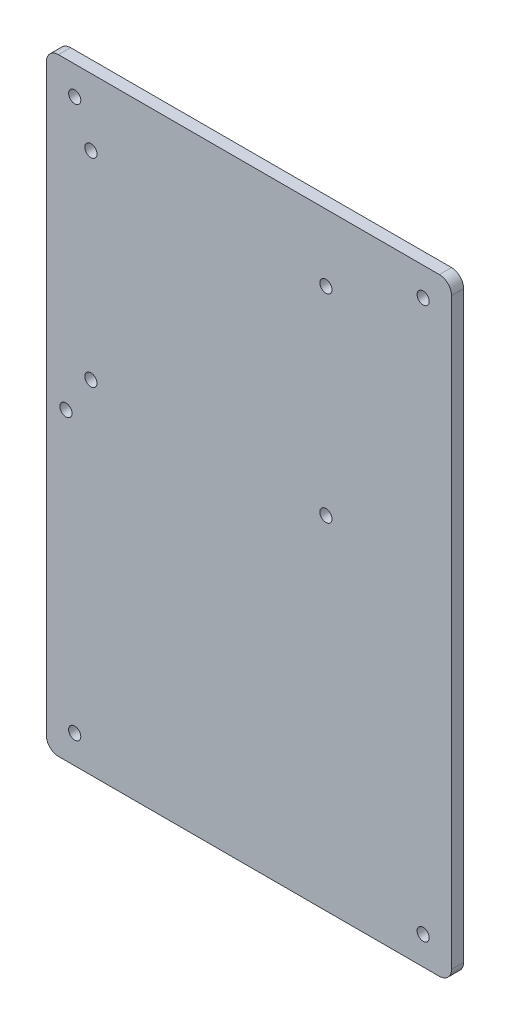
ISO-10303-21;
HEADER;
FILE_DESCRIPTION(('STEP AP214'),'2;1');
FILE_NAME('part.step','',(''),(''),'','','');
FILE_SCHEMA(('AUTOMOTIVE_DESIGN { 1 0 10303 214 1 1 1 1 }'));
ENDSEC;
DATA;
#1=APPLICATION_CONTEXT('core data for automotive mechanical design processes');
#2=APPLICATION_PROTOCOL_DEFINITION('international standard','automotive_design',2000,#1);
#3=PRODUCT_CONTEXT('',#1,'mechanical');
#4=PRODUCT('Part','Part','',(#3));
#5=PRODUCT_RELATED_PRODUCT_CATEGORY('part','',(#4));
#6=PRODUCT_DEFINITION_FORMATION('','',#4);
#7=PRODUCT_DEFINITION_CONTEXT('part definition',#1,'design');
#8=PRODUCT_DEFINITION('design','',#6,#7);
#9=PRODUCT_DEFINITION_SHAPE('','',#8);
#10=(LENGTH_UNIT() NAMED_UNIT(*) SI_UNIT(.MILLI.,.METRE.));
#11=(NAMED_UNIT(*) PLANE_ANGLE_UNIT() SI_UNIT($,.RADIAN.));
#12=(NAMED_UNIT(*) SI_UNIT($,.STERADIAN.) SOLID_ANGLE_UNIT());
#13=UNCERTAINTY_MEASURE_WITH_UNIT(LENGTH_MEASURE(1.E-05),#10,'distance_accuracy_value','');
#14=(GEOMETRIC_REPRESENTATION_CONTEXT(3) GLOBAL_UNCERTAINTY_ASSIGNED_CONTEXT((#13)) GLOBAL_UNIT_ASSIGNED_CONTEXT((#10,
#11,#12)) REPRESENTATION_CONTEXT('',''));
#15=CARTESIAN_POINT('',(0.,0.,0.));
#16=DIRECTION('',(0.,0.,1.));
#17=DIRECTION('',(1.,0.,0.));
#18=AXIS2_PLACEMENT_3D('',#15,#16,#17);
#19=CARTESIAN_POINT('',(-102.,-59.,40.));
#20=DIRECTION('',(0.,0.,1.));
#21=DIRECTION('',(1.,0.,0.));
#22=AXIS2_PLACEMENT_3D('',#19,#20,#21);
#23=CYLINDRICAL_SURFACE('',#22,3.);
#24=CARTESIAN_POINT('',(-102.,-59.,43.));
#25=DIRECTION('',(0.,0.,1.));
#26=DIRECTION('',(1.,0.,0.));
#27=AXIS2_PLACEMENT_3D('',#24,#25,#26);
#28=CIRCLE('',#27,3.);
#29=CARTESIAN_POINT('',(-105.,-59.,43.));
#30=VERTEX_POINT('',#29);
#31=CARTESIAN_POINT('',(-102.,-62.,43.));
#32=VERTEX_POINT('',#31);
#33=EDGE_CURVE('E134',#30,#32,#28,.T.);
#34=ORIENTED_EDGE('',*,*,#33,.F.);
#35=DIRECTION('',(0.,0.,1.));
#36=VECTOR('',#35,1.);
#37=CARTESIAN_POINT('',(-105.,-59.,40.));
#38=LINE('',#37,#36);
#39=CARTESIAN_POINT('',(-105.,-59.,40.));
#40=VERTEX_POINT('',#39);
#41=EDGE_CURVE('E11',#40,#30,#38,.T.);
#42=ORIENTED_EDGE('',*,*,#41,.F.);
#43=CARTESIAN_POINT('',(-102.,-59.,40.));
#44=DIRECTION('',(0.,0.,1.));
#45=DIRECTION('',(1.,0.,0.));
#46=AXIS2_PLACEMENT_3D('',#43,#44,#45);
#47=CIRCLE('',#46,3.);
#48=CARTESIAN_POINT('',(-102.,-62.,40.));
#49=VERTEX_POINT('',#48);
#50=EDGE_CURVE('E155',#40,#49,#47,.T.);
#51=ORIENTED_EDGE('',*,*,#50,.T.);
#52=DIRECTION('',(0.,0.,1.));
#53=VECTOR('',#52,1.);
#54=CARTESIAN_POINT('',(-102.,-62.,40.));
#55=LINE('',#54,#53);
#56=EDGE_CURVE('E40',#49,#32,#55,.T.);
#57=ORIENTED_EDGE('',*,*,#56,.T.);
#58=EDGE_LOOP('',(#34,#42,#51,#57));
#59=FACE_BOUND('',#58,.T.);
#60=ADVANCED_FACE('F37',(#59),#23,.T.);
#61=CARTESIAN_POINT('',(-105.,85.,40.));
#62=DIRECTION('',(-1.,0.,0.));
#63=DIRECTION('',(0.,0.,1.));
#64=AXIS2_PLACEMENT_3D('',#61,#62,#63);
#65=PLANE('',#64);
#66=DIRECTION('',(0.,-1.,0.));
#67=VECTOR('',#66,1.);
#68=CARTESIAN_POINT('',(-105.,85.,43.));
#69=LINE('',#68,#67);
#70=CARTESIAN_POINT('',(-105.,85.,43.));
#71=VERTEX_POINT('',#70);
#72=EDGE_CURVE('E153',#71,#30,#69,.T.);
#73=ORIENTED_EDGE('',*,*,#72,.F.);
#74=DIRECTION('',(0.,0.,1.));
#75=VECTOR('',#74,1.);
#76=CARTESIAN_POINT('',(-105.,85.,40.));
#77=LINE('',#76,#75);
#78=CARTESIAN_POINT('',(-105.,85.,40.));
#79=VERTEX_POINT('',#78);
#80=EDGE_CURVE('E46',#79,#71,#77,.T.);
#81=ORIENTED_EDGE('',*,*,#80,.F.);
#82=DIRECTION('',(0.,-1.,0.));
#83=VECTOR('',#82,1.);
#84=CARTESIAN_POINT('',(-105.,85.,40.));
#85=LINE('',#84,#83);
#86=EDGE_CURVE('E124',#79,#40,#85,.T.);
#87=ORIENTED_EDGE('',*,*,#86,.T.);
#88=ORIENTED_EDGE('',*,*,#41,.T.);
#89=EDGE_LOOP('',(#73,#81,#87,#88));
#90=FACE_BOUND('',#89,.T.);
#91=ADVANCED_FACE('F167',(#90),#65,.T.);
#92=CARTESIAN_POINT('',(-102.,85.,40.));
#93=DIRECTION('',(0.,0.,1.));
#94=DIRECTION('',(1.,0.,0.));
#95=AXIS2_PLACEMENT_3D('',#92,#93,#94);
#96=CYLINDRICAL_SURFACE('',#95,3.);
#97=CARTESIAN_POINT('',(-102.,85.,43.));
#98=DIRECTION('',(0.,0.,1.));
#99=DIRECTION('',(1.,0.,0.));
#100=AXIS2_PLACEMENT_3D('',#97,#98,#99);
#101=CIRCLE('',#100,3.);
#102=CARTESIAN_POINT('',(-102.,88.,43.));
#103=VERTEX_POINT('',#102);
#104=EDGE_CURVE('E111',#103,#71,#101,.T.);
#105=ORIENTED_EDGE('',*,*,#104,.F.);
#106=DIRECTION('',(0.,0.,1.));
#107=VECTOR('',#106,1.);
#108=CARTESIAN_POINT('',(-102.,88.,40.));
#109=LINE('',#108,#107);
#110=CARTESIAN_POINT('',(-102.,88.,40.));
#111=VERTEX_POINT('',#110);
#112=EDGE_CURVE('E106',#111,#103,#109,.T.);
#113=ORIENTED_EDGE('',*,*,#112,.F.);
#114=CARTESIAN_POINT('',(-102.,85.,40.));
#115=DIRECTION('',(0.,0.,1.));
#116=DIRECTION('',(1.,0.,0.));
#117=AXIS2_PLACEMENT_3D('',#114,#115,#116);
#118=CIRCLE('',#117,3.);
#119=EDGE_CURVE('E109',#111,#79,#118,.T.);
#120=ORIENTED_EDGE('',*,*,#119,.T.);
#121=ORIENTED_EDGE('',*,*,#80,.T.);
#122=EDGE_LOOP('',(#105,#113,#120,#121));
#123=FACE_BOUND('',#122,.T.);
#124=ADVANCED_FACE('F108',(#123),#96,.T.);
#125=CARTESIAN_POINT('',(-8.,88.,40.));
#126=DIRECTION('',(0.,1.,0.));
#127=DIRECTION('',(0.,0.,1.));
#128=AXIS2_PLACEMENT_3D('',#125,#126,#127);
#129=PLANE('',#128);
#130=DIRECTION('',(-1.,0.,0.));
#131=VECTOR('',#130,1.);
#132=CARTESIAN_POINT('',(-8.,88.,43.));
#133=LINE('',#132,#131);
#134=CARTESIAN_POINT('',(-8.,88.,43.));
#135=VERTEX_POINT('',#134);
#136=EDGE_CURVE('E150',#135,#103,#133,.T.);
#137=ORIENTED_EDGE('',*,*,#136,.F.);
#138=DIRECTION('',(0.,0.,1.));
#139=VECTOR('',#138,1.);
#140=CARTESIAN_POINT('',(-8.,88.,40.));
#141=LINE('',#140,#139);
#142=CARTESIAN_POINT('',(-8.,88.,40.));
#143=VERTEX_POINT('',#142);
#144=EDGE_CURVE('E116',#143,#135,#141,.T.);
#145=ORIENTED_EDGE('',*,*,#144,.F.);
#146=DIRECTION('',(-1.,0.,0.));
#147=VECTOR('',#146,1.);
#148=CARTESIAN_POINT('',(-8.,88.,40.));
#149=LINE('',#148,#147);
#150=EDGE_CURVE('E122',#143,#111,#149,.T.);
#151=ORIENTED_EDGE('',*,*,#150,.T.);
#152=ORIENTED_EDGE('',*,*,#112,.T.);
#153=EDGE_LOOP('',(#137,#145,#151,#152));
#154=FACE_BOUND('',#153,.T.);
#155=ADVANCED_FACE('F126',(#154),#129,.T.);
#156=CARTESIAN_POINT('',(-8.,85.,40.));
#157=DIRECTION('',(0.,0.,1.));
#158=DIRECTION('',(1.,0.,0.));
#159=AXIS2_PLACEMENT_3D('',#156,#157,#158);
#160=CYLINDRICAL_SURFACE('',#159,2.99999999999999);
#161=CARTESIAN_POINT('',(-8.,85.,43.));
#162=DIRECTION('',(0.,0.,1.));
#163=DIRECTION('',(1.,0.,0.));
#164=AXIS2_PLACEMENT_3D('',#161,#162,#163);
#165=CIRCLE('',#164,2.99999999999999);
#166=CARTESIAN_POINT('',(-5.,85.,43.));
#167=VERTEX_POINT('',#166);
#168=EDGE_CURVE('E147',#167,#135,#165,.T.);
#169=ORIENTED_EDGE('',*,*,#168,.F.);
#170=DIRECTION('',(0.,0.,1.));
#171=VECTOR('',#170,1.);
#172=CARTESIAN_POINT('',(-5.,85.,40.));
#173=LINE('',#172,#171);
#174=CARTESIAN_POINT('',(-5.,85.,40.));
#175=VERTEX_POINT('',#174);
#176=EDGE_CURVE('E159',#175,#167,#173,.T.);
#177=ORIENTED_EDGE('',*,*,#176,.F.);
#178=CARTESIAN_POINT('',(-8.,85.,40.));
#179=DIRECTION('',(0.,0.,1.));
#180=DIRECTION('',(1.,0.,0.));
#181=AXIS2_PLACEMENT_3D('',#178,#179,#180);
#182=CIRCLE('',#181,2.99999999999999);
#183=EDGE_CURVE('E127',#175,#143,#182,.T.);
#184=ORIENTED_EDGE('',*,*,#183,.T.);
#185=ORIENTED_EDGE('',*,*,#144,.T.);
#186=EDGE_LOOP('',(#169,#177,#184,#185));
#187=FACE_BOUND('',#186,.T.);
#188=ADVANCED_FACE('F180',(#187),#160,.T.);
#189=CARTESIAN_POINT('',(-5.,-59.,40.));
#190=DIRECTION('',(1.,0.,0.));
#191=DIRECTION('',(0.,0.,-1.));
#192=AXIS2_PLACEMENT_3D('',#189,#190,#191);
#193=PLANE('',#192);
#194=DIRECTION('',(0.,1.,0.));
#195=VECTOR('',#194,1.);
#196=CARTESIAN_POINT('',(-5.,-59.,43.));
#197=LINE('',#196,#195);
#198=CARTESIAN_POINT('',(-5.,-59.,43.));
#199=VERTEX_POINT('',#198);
#200=EDGE_CURVE('E144',#199,#167,#197,.T.);
#201=ORIENTED_EDGE('',*,*,#200,.F.);
#202=DIRECTION('',(0.,0.,1.));
#203=VECTOR('',#202,1.);
#204=CARTESIAN_POINT('',(-5.,-59.,40.));
#205=LINE('',#204,#203);
#206=CARTESIAN_POINT('',(-5.,-59.,40.));
#207=VERTEX_POINT('',#206);
#208=EDGE_CURVE('E161',#207,#199,#205,.T.);
#209=ORIENTED_EDGE('',*,*,#208,.F.);
#210=DIRECTION('',(0.,1.,0.));
#211=VECTOR('',#210,1.);
#212=CARTESIAN_POINT('',(-5.,-59.,40.));
#213=LINE('',#212,#211);
#214=EDGE_CURVE('E129',#207,#175,#213,.T.);
#215=ORIENTED_EDGE('',*,*,#214,.T.);
#216=ORIENTED_EDGE('',*,*,#176,.T.);
#217=EDGE_LOOP('',(#201,#209,#215,#216));
#218=FACE_BOUND('',#217,.T.);
#219=ADVANCED_FACE('F183',(#218),#193,.T.);
#220=CARTESIAN_POINT('',(-8.,-59.,40.));
#221=DIRECTION('',(0.,0.,1.));
#222=DIRECTION('',(1.,0.,0.));
#223=AXIS2_PLACEMENT_3D('',#220,#221,#222);
#224=CYLINDRICAL_SURFACE('',#223,3.);
#225=CARTESIAN_POINT('',(-8.,-59.,43.));
#226=DIRECTION('',(0.,0.,1.));
#227=DIRECTION('',(1.,0.,0.));
#228=AXIS2_PLACEMENT_3D('',#225,#226,#227);
#229=CIRCLE('',#228,3.);
#230=CARTESIAN_POINT('',(-8.,-62.,43.));
#231=VERTEX_POINT('',#230);
#232=EDGE_CURVE('E141',#231,#199,#229,.T.);
#233=ORIENTED_EDGE('',*,*,#232,.F.);
#234=DIRECTION('',(0.,0.,1.));
#235=VECTOR('',#234,1.);
#236=CARTESIAN_POINT('',(-8.,-62.,40.));
#237=LINE('',#236,#235);
#238=CARTESIAN_POINT('',(-8.,-62.,40.));
#239=VERTEX_POINT('',#238);
#240=EDGE_CURVE('E162',#239,#231,#237,.T.);
#241=ORIENTED_EDGE('',*,*,#240,.F.);
#242=CARTESIAN_POINT('',(-8.,-59.,40.));
#243=DIRECTION('',(0.,0.,1.));
#244=DIRECTION('',(1.,0.,0.));
#245=AXIS2_PLACEMENT_3D('',#242,#243,#244);
#246=CIRCLE('',#245,3.);
#247=EDGE_CURVE('E299',#239,#207,#246,.T.);
#248=ORIENTED_EDGE('',*,*,#247,.T.);
#249=ORIENTED_EDGE('',*,*,#208,.T.);
#250=EDGE_LOOP('',(#233,#241,#248,#249));
#251=FACE_BOUND('',#250,.T.);
#252=ADVANCED_FACE('F187',(#251),#224,.T.);
#253=CARTESIAN_POINT('',(-102.,-62.,40.));
#254=DIRECTION('',(0.,-1.,0.));
#255=DIRECTION('',(0.,0.,-1.));
#256=AXIS2_PLACEMENT_3D('',#253,#254,#255);
#257=PLANE('',#256);
#258=DIRECTION('',(1.,0.,0.));
#259=VECTOR('',#258,1.);
#260=CARTESIAN_POINT('',(-102.,-62.,43.));
#261=LINE('',#260,#259);
#262=EDGE_CURVE('E137',#32,#231,#261,.T.);
#263=ORIENTED_EDGE('',*,*,#262,.F.);
#264=ORIENTED_EDGE('',*,*,#56,.F.);
#265=DIRECTION('',(1.,0.,0.));
#266=VECTOR('',#265,1.);
#267=CARTESIAN_POINT('',(-102.,-62.,40.));
#268=LINE('',#267,#266);
#269=EDGE_CURVE('E297',#49,#239,#268,.T.);
#270=ORIENTED_EDGE('',*,*,#269,.T.);
#271=ORIENTED_EDGE('',*,*,#240,.T.);
#272=EDGE_LOOP('',(#263,#264,#270,#271));
#273=FACE_BOUND('',#272,.T.);
#274=ADVANCED_FACE('F164',(#273),#257,.T.);
#275=CARTESIAN_POINT('',(-102.,-59.,40.));
#276=DIRECTION('',(0.,0.,1.));
#277=DIRECTION('',(1.,0.,0.));
#278=AXIS2_PLACEMENT_3D('',#275,#276,#277);
#279=PLANE('',#278);
#280=CARTESIAN_POINT('',(-12.,-55.,40.));
#281=DIRECTION('',(0.,0.,1.));
#282=DIRECTION('',(-1.,0.,0.));
#283=AXIS2_PLACEMENT_3D('',#280,#281,#282);
#284=CIRCLE('',#283,1.5);
#285=CARTESIAN_POINT('',(-13.5,-55.,40.));
#286=VERTEX_POINT('',#285);
#287=EDGE_CURVE('E242',#286,#286,#284,.T.);
#288=ORIENTED_EDGE('',*,*,#287,.T.);
#289=EDGE_LOOP('',(#288));
#290=FACE_BOUND('',#289,.T.);
#291=CARTESIAN_POINT('',(-98.,81.,40.));
#292=DIRECTION('',(0.,0.,1.));
#293=DIRECTION('',(-1.,0.,0.));
#294=AXIS2_PLACEMENT_3D('',#291,#292,#293);
#295=CIRCLE('',#294,1.5);
#296=CARTESIAN_POINT('',(-99.5,81.,40.));
#297=VERTEX_POINT('',#296);
#298=EDGE_CURVE('E250',#297,#297,#295,.T.);
#299=ORIENTED_EDGE('',*,*,#298,.T.);
#300=EDGE_LOOP('',(#299));
#301=FACE_BOUND('',#300,.T.);
#302=CARTESIAN_POINT('',(-98.,-55.,40.));
#303=DIRECTION('',(0.,0.,1.));
#304=DIRECTION('',(-1.,0.,0.));
#305=AXIS2_PLACEMENT_3D('',#302,#303,#304);
#306=CIRCLE('',#305,1.5);
#307=CARTESIAN_POINT('',(-99.5,-55.,40.));
#308=VERTEX_POINT('',#307);
#309=EDGE_CURVE('E256',#308,#308,#306,.T.);
#310=ORIENTED_EDGE('',*,*,#309,.T.);
#311=EDGE_LOOP('',(#310));
#312=FACE_BOUND('',#311,.T.);
#313=CARTESIAN_POINT('',(-12.,81.,40.));
#314=DIRECTION('',(0.,0.,1.));
#315=DIRECTION('',(-1.,0.,0.));
#316=AXIS2_PLACEMENT_3D('',#313,#314,#315);
#317=CIRCLE('',#316,1.5);
#318=CARTESIAN_POINT('',(-13.5,81.,40.));
#319=VERTEX_POINT('',#318);
#320=EDGE_CURVE('E262',#319,#319,#317,.T.);
#321=ORIENTED_EDGE('',*,*,#320,.T.);
#322=EDGE_LOOP('',(#321));
#323=FACE_BOUND('',#322,.T.);
#324=CARTESIAN_POINT('',(-100.157022476196,13.,40.));
#325=DIRECTION('',(0.,0.,1.));
#326=DIRECTION('',(-1.,0.,0.));
#327=AXIS2_PLACEMENT_3D('',#324,#325,#326);
#328=CIRCLE('',#327,1.5);
#329=CARTESIAN_POINT('',(-101.657022476196,13.,40.));
#330=VERTEX_POINT('',#329);
#331=EDGE_CURVE('E268',#330,#330,#328,.T.);
#332=ORIENTED_EDGE('',*,*,#331,.T.);
#333=EDGE_LOOP('',(#332));
#334=FACE_BOUND('',#333,.T.);
#335=CARTESIAN_POINT('',(-36.,71.5,40.));
#336=DIRECTION('',(0.,0.,1.));
#337=DIRECTION('',(-1.,0.,0.));
#338=AXIS2_PLACEMENT_3D('',#335,#336,#337);
#339=CIRCLE('',#338,1.5);
#340=CARTESIAN_POINT('',(-37.5,71.5,40.));
#341=VERTEX_POINT('',#340);
#342=EDGE_CURVE('E274',#341,#341,#339,.T.);
#343=ORIENTED_EDGE('',*,*,#342,.T.);
#344=EDGE_LOOP('',(#343));
#345=FACE_BOUND('',#344,.T.);
#346=CARTESIAN_POINT('',(-36.,22.5,40.));
#347=DIRECTION('',(0.,0.,1.));
#348=DIRECTION('',(-1.,0.,0.));
#349=AXIS2_PLACEMENT_3D('',#346,#347,#348);
#350=CIRCLE('',#349,1.5);
#351=CARTESIAN_POINT('',(-37.5,22.5,40.));
#352=VERTEX_POINT('',#351);
#353=EDGE_CURVE('E280',#352,#352,#350,.T.);
#354=ORIENTED_EDGE('',*,*,#353,.T.);
#355=EDGE_LOOP('',(#354));
#356=FACE_BOUND('',#355,.T.);
#357=CARTESIAN_POINT('',(-94.,22.5,40.));
#358=DIRECTION('',(0.,0.,1.));
#359=DIRECTION('',(-1.,0.,0.));
#360=AXIS2_PLACEMENT_3D('',#357,#358,#359);
#361=CIRCLE('',#360,1.5);
#362=CARTESIAN_POINT('',(-95.5,22.5,40.));
#363=VERTEX_POINT('',#362);
#364=EDGE_CURVE('E286',#363,#363,#361,.T.);
#365=ORIENTED_EDGE('',*,*,#364,.T.);
#366=EDGE_LOOP('',(#365));
#367=FACE_BOUND('',#366,.T.);
#368=CARTESIAN_POINT('',(-94.,71.5,40.));
#369=DIRECTION('',(0.,0.,1.));
#370=DIRECTION('',(-1.,0.,0.));
#371=AXIS2_PLACEMENT_3D('',#368,#369,#370);
#372=CIRCLE('',#371,1.5);
#373=CARTESIAN_POINT('',(-95.5,71.5,40.));
#374=VERTEX_POINT('',#373);
#375=EDGE_CURVE('E138',#374,#374,#372,.T.);
#376=ORIENTED_EDGE('',*,*,#375,.T.);
#377=EDGE_LOOP('',(#376));
#378=FACE_BOUND('',#377,.T.);
#379=ORIENTED_EDGE('',*,*,#50,.F.);
#380=ORIENTED_EDGE('',*,*,#86,.F.);
#381=ORIENTED_EDGE('',*,*,#119,.F.);
#382=ORIENTED_EDGE('',*,*,#150,.F.);
#383=ORIENTED_EDGE('',*,*,#183,.F.);
#384=ORIENTED_EDGE('',*,*,#214,.F.);
#385=ORIENTED_EDGE('',*,*,#247,.F.);
#386=ORIENTED_EDGE('',*,*,#269,.F.);
#387=EDGE_LOOP('',(#379,#380,#381,#382,#383,#384,#385,#386));
#388=FACE_BOUND('',#387,.T.);
#389=ADVANCED_FACE('F120',(#290,#301,#312,#323,#334,#345,#356,#367,#378,#388),#279,.F.);
#390=CARTESIAN_POINT('',(-102.,-59.,43.));
#391=DIRECTION('',(0.,0.,1.));
#392=DIRECTION('',(1.,0.,0.));
#393=AXIS2_PLACEMENT_3D('',#390,#391,#392);
#394=PLANE('',#393);
#395=CARTESIAN_POINT('',(-12.,-55.,43.));
#396=DIRECTION('',(0.,0.,1.));
#397=DIRECTION('',(-1.,0.,0.));
#398=AXIS2_PLACEMENT_3D('',#395,#396,#397);
#399=CIRCLE('',#398,1.5);
#400=CARTESIAN_POINT('',(-13.5,-55.,43.));
#401=VERTEX_POINT('',#400);
#402=EDGE_CURVE('E245',#401,#401,#399,.T.);
#403=ORIENTED_EDGE('',*,*,#402,.F.);
#404=EDGE_LOOP('',(#403));
#405=FACE_BOUND('',#404,.T.);
#406=CARTESIAN_POINT('',(-98.,81.,43.));
#407=DIRECTION('',(0.,0.,1.));
#408=DIRECTION('',(-1.,0.,0.));
#409=AXIS2_PLACEMENT_3D('',#406,#407,#408);
#410=CIRCLE('',#409,1.5);
#411=CARTESIAN_POINT('',(-99.5,81.,43.));
#412=VERTEX_POINT('',#411);
#413=EDGE_CURVE('E247',#412,#412,#410,.T.);
#414=ORIENTED_EDGE('',*,*,#413,.F.);
#415=EDGE_LOOP('',(#414));
#416=FACE_BOUND('',#415,.T.);
#417=CARTESIAN_POINT('',(-98.,-55.,43.));
#418=DIRECTION('',(0.,0.,1.));
#419=DIRECTION('',(-1.,0.,0.));
#420=AXIS2_PLACEMENT_3D('',#417,#418,#419);
#421=CIRCLE('',#420,1.5);
#422=CARTESIAN_POINT('',(-99.5,-55.,43.));
#423=VERTEX_POINT('',#422);
#424=EDGE_CURVE('E253',#423,#423,#421,.T.);
#425=ORIENTED_EDGE('',*,*,#424,.F.);
#426=EDGE_LOOP('',(#425));
#427=FACE_BOUND('',#426,.T.);
#428=CARTESIAN_POINT('',(-12.,81.,43.));
#429=DIRECTION('',(0.,0.,1.));
#430=DIRECTION('',(-1.,0.,0.));
#431=AXIS2_PLACEMENT_3D('',#428,#429,#430);
#432=CIRCLE('',#431,1.5);
#433=CARTESIAN_POINT('',(-13.5,81.,43.));
#434=VERTEX_POINT('',#433);
#435=EDGE_CURVE('E259',#434,#434,#432,.T.);
#436=ORIENTED_EDGE('',*,*,#435,.F.);
#437=EDGE_LOOP('',(#436));
#438=FACE_BOUND('',#437,.T.);
#439=CARTESIAN_POINT('',(-100.157022476196,13.,43.));
#440=DIRECTION('',(0.,0.,1.));
#441=DIRECTION('',(-1.,0.,0.));
#442=AXIS2_PLACEMENT_3D('',#439,#440,#441);
#443=CIRCLE('',#442,1.5);
#444=CARTESIAN_POINT('',(-101.657022476196,13.,43.));
#445=VERTEX_POINT('',#444);
#446=EDGE_CURVE('E265',#445,#445,#443,.T.);
#447=ORIENTED_EDGE('',*,*,#446,.F.);
#448=EDGE_LOOP('',(#447));
#449=FACE_BOUND('',#448,.T.);
#450=CARTESIAN_POINT('',(-36.,71.5,43.));
#451=DIRECTION('',(0.,0.,1.));
#452=DIRECTION('',(-1.,0.,0.));
#453=AXIS2_PLACEMENT_3D('',#450,#451,#452);
#454=CIRCLE('',#453,1.5);
#455=CARTESIAN_POINT('',(-37.5,71.5,43.));
#456=VERTEX_POINT('',#455);
#457=EDGE_CURVE('E271',#456,#456,#454,.T.);
#458=ORIENTED_EDGE('',*,*,#457,.F.);
#459=EDGE_LOOP('',(#458));
#460=FACE_BOUND('',#459,.T.);
#461=CARTESIAN_POINT('',(-36.,22.5,43.));
#462=DIRECTION('',(0.,0.,1.));
#463=DIRECTION('',(-1.,0.,0.));
#464=AXIS2_PLACEMENT_3D('',#461,#462,#463);
#465=CIRCLE('',#464,1.5);
#466=CARTESIAN_POINT('',(-37.5,22.5,43.));
#467=VERTEX_POINT('',#466);
#468=EDGE_CURVE('E277',#467,#467,#465,.T.);
#469=ORIENTED_EDGE('',*,*,#468,.F.);
#470=EDGE_LOOP('',(#469));
#471=FACE_BOUND('',#470,.T.);
#472=CARTESIAN_POINT('',(-94.,22.5,43.));
#473=DIRECTION('',(0.,0.,1.));
#474=DIRECTION('',(-1.,0.,0.));
#475=AXIS2_PLACEMENT_3D('',#472,#473,#474);
#476=CIRCLE('',#475,1.5);
#477=CARTESIAN_POINT('',(-95.5,22.5,43.));
#478=VERTEX_POINT('',#477);
#479=EDGE_CURVE('E283',#478,#478,#476,.T.);
#480=ORIENTED_EDGE('',*,*,#479,.F.);
#481=EDGE_LOOP('',(#480));
#482=FACE_BOUND('',#481,.T.);
#483=CARTESIAN_POINT('',(-94.,71.5,43.));
#484=DIRECTION('',(0.,0.,1.));
#485=DIRECTION('',(-1.,0.,0.));
#486=AXIS2_PLACEMENT_3D('',#483,#484,#485);
#487=CIRCLE('',#486,1.5);
#488=CARTESIAN_POINT('',(-95.5,71.5,43.));
#489=VERTEX_POINT('',#488);
#490=EDGE_CURVE('E289',#489,#489,#487,.T.);
#491=ORIENTED_EDGE('',*,*,#490,.F.);
#492=EDGE_LOOP('',(#491));
#493=FACE_BOUND('',#492,.T.);
#494=ORIENTED_EDGE('',*,*,#33,.T.);
#495=ORIENTED_EDGE('',*,*,#262,.T.);
#496=ORIENTED_EDGE('',*,*,#232,.T.);
#497=ORIENTED_EDGE('',*,*,#200,.T.);
#498=ORIENTED_EDGE('',*,*,#168,.T.);
#499=ORIENTED_EDGE('',*,*,#136,.T.);
#500=ORIENTED_EDGE('',*,*,#104,.T.);
#501=ORIENTED_EDGE('',*,*,#72,.T.);
#502=EDGE_LOOP('',(#494,#495,#496,#497,#498,#499,#500,#501));
#503=FACE_BOUND('',#502,.T.);
#504=ADVANCED_FACE('F166',(#405,#416,#427,#438,#449,#460,#471,#482,#493,#503),#394,.T.);
#505=CARTESIAN_POINT('',(-94.,71.5,40.));
#506=DIRECTION('',(0.,0.,1.));
#507=DIRECTION('',(1.,0.,0.));
#508=AXIS2_PLACEMENT_3D('',#505,#506,#507);
#509=CYLINDRICAL_SURFACE('',#508,1.5);
#510=ORIENTED_EDGE('',*,*,#375,.F.);
#511=EDGE_LOOP('',(#510));
#512=FACE_BOUND('',#511,.T.);
#513=ORIENTED_EDGE('',*,*,#490,.T.);
#514=EDGE_LOOP('',(#513));
#515=FACE_BOUND('',#514,.T.);
#516=ADVANCED_FACE('F199',(#512,#515),#509,.F.);
#517=CARTESIAN_POINT('',(-94.,22.5,40.));
#518=DIRECTION('',(0.,0.,1.));
#519=DIRECTION('',(1.,0.,0.));
#520=AXIS2_PLACEMENT_3D('',#517,#518,#519);
#521=CYLINDRICAL_SURFACE('',#520,1.5);
#522=ORIENTED_EDGE('',*,*,#364,.F.);
#523=EDGE_LOOP('',(#522));
#524=FACE_BOUND('',#523,.T.);
#525=ORIENTED_EDGE('',*,*,#479,.T.);
#526=EDGE_LOOP('',(#525));
#527=FACE_BOUND('',#526,.T.);
#528=ADVANCED_FACE('F206',(#524,#527),#521,.F.);
#529=CARTESIAN_POINT('',(-36.,22.5,40.));
#530=DIRECTION('',(0.,0.,1.));
#531=DIRECTION('',(1.,0.,0.));
#532=AXIS2_PLACEMENT_3D('',#529,#530,#531);
#533=CYLINDRICAL_SURFACE('',#532,1.5);
#534=ORIENTED_EDGE('',*,*,#353,.F.);
#535=EDGE_LOOP('',(#534));
#536=FACE_BOUND('',#535,.T.);
#537=ORIENTED_EDGE('',*,*,#468,.T.);
#538=EDGE_LOOP('',(#537));
#539=FACE_BOUND('',#538,.T.);
#540=ADVANCED_FACE('F210',(#536,#539),#533,.F.);
#541=CARTESIAN_POINT('',(-36.,71.5,40.));
#542=DIRECTION('',(0.,0.,1.));
#543=DIRECTION('',(1.,0.,0.));
#544=AXIS2_PLACEMENT_3D('',#541,#542,#543);
#545=CYLINDRICAL_SURFACE('',#544,1.5);
#546=ORIENTED_EDGE('',*,*,#342,.F.);
#547=EDGE_LOOP('',(#546));
#548=FACE_BOUND('',#547,.T.);
#549=ORIENTED_EDGE('',*,*,#457,.T.);
#550=EDGE_LOOP('',(#549));
#551=FACE_BOUND('',#550,.T.);
#552=ADVANCED_FACE('F214',(#548,#551),#545,.F.);
#553=CARTESIAN_POINT('',(-100.157022476196,13.,40.));
#554=DIRECTION('',(0.,0.,1.));
#555=DIRECTION('',(1.,0.,0.));
#556=AXIS2_PLACEMENT_3D('',#553,#554,#555);
#557=CYLINDRICAL_SURFACE('',#556,1.5);
#558=ORIENTED_EDGE('',*,*,#331,.F.);
#559=EDGE_LOOP('',(#558));
#560=FACE_BOUND('',#559,.T.);
#561=ORIENTED_EDGE('',*,*,#446,.T.);
#562=EDGE_LOOP('',(#561));
#563=FACE_BOUND('',#562,.T.);
#564=ADVANCED_FACE('F218',(#560,#563),#557,.F.);
#565=CARTESIAN_POINT('',(-12.,81.,40.));
#566=DIRECTION('',(0.,0.,1.));
#567=DIRECTION('',(1.,0.,0.));
#568=AXIS2_PLACEMENT_3D('',#565,#566,#567);
#569=CYLINDRICAL_SURFACE('',#568,1.5);
#570=ORIENTED_EDGE('',*,*,#320,.F.);
#571=EDGE_LOOP('',(#570));
#572=FACE_BOUND('',#571,.T.);
#573=ORIENTED_EDGE('',*,*,#435,.T.);
#574=EDGE_LOOP('',(#573));
#575=FACE_BOUND('',#574,.T.);
#576=ADVANCED_FACE('F222',(#572,#575),#569,.F.);
#577=CARTESIAN_POINT('',(-98.,-55.,40.));
#578=DIRECTION('',(0.,0.,1.));
#579=DIRECTION('',(1.,0.,0.));
#580=AXIS2_PLACEMENT_3D('',#577,#578,#579);
#581=CYLINDRICAL_SURFACE('',#580,1.5);
#582=ORIENTED_EDGE('',*,*,#309,.F.);
#583=EDGE_LOOP('',(#582));
#584=FACE_BOUND('',#583,.T.);
#585=ORIENTED_EDGE('',*,*,#424,.T.);
#586=EDGE_LOOP('',(#585));
#587=FACE_BOUND('',#586,.T.);
#588=ADVANCED_FACE('F226',(#584,#587),#581,.F.);
#589=CARTESIAN_POINT('',(-98.,81.,40.));
#590=DIRECTION('',(0.,0.,1.));
#591=DIRECTION('',(1.,0.,0.));
#592=AXIS2_PLACEMENT_3D('',#589,#590,#591);
#593=CYLINDRICAL_SURFACE('',#592,1.5);
#594=ORIENTED_EDGE('',*,*,#298,.F.);
#595=EDGE_LOOP('',(#594));
#596=FACE_BOUND('',#595,.T.);
#597=ORIENTED_EDGE('',*,*,#413,.T.);
#598=EDGE_LOOP('',(#597));
#599=FACE_BOUND('',#598,.T.);
#600=ADVANCED_FACE('F230',(#596,#599),#593,.F.);
#601=CARTESIAN_POINT('',(-12.,-55.,40.));
#602=DIRECTION('',(0.,0.,1.));
#603=DIRECTION('',(1.,0.,0.));
#604=AXIS2_PLACEMENT_3D('',#601,#602,#603);
#605=CYLINDRICAL_SURFACE('',#604,1.5);
#606=ORIENTED_EDGE('',*,*,#287,.F.);
#607=EDGE_LOOP('',(#606));
#608=FACE_BOUND('',#607,.T.);
#609=ORIENTED_EDGE('',*,*,#402,.T.);
#610=EDGE_LOOP('',(#609));
#611=FACE_BOUND('',#610,.T.);
#612=ADVANCED_FACE('F234',(#608,#611),#605,.F.);
#613=CLOSED_SHELL('',(#60,#91,#124,#155,#188,#219,#252,#274,#389,#504,#516,#528,#540,#552,#564,
#576,#588,#600,#612));
#614=MANIFOLD_SOLID_BREP('B2',#613);
#615=ADVANCED_BREP_SHAPE_REPRESENTATION('',(#18,#614),#14);
#616=SHAPE_DEFINITION_REPRESENTATION(#9,#615);
ENDSEC;
END-ISO-10303-21;
